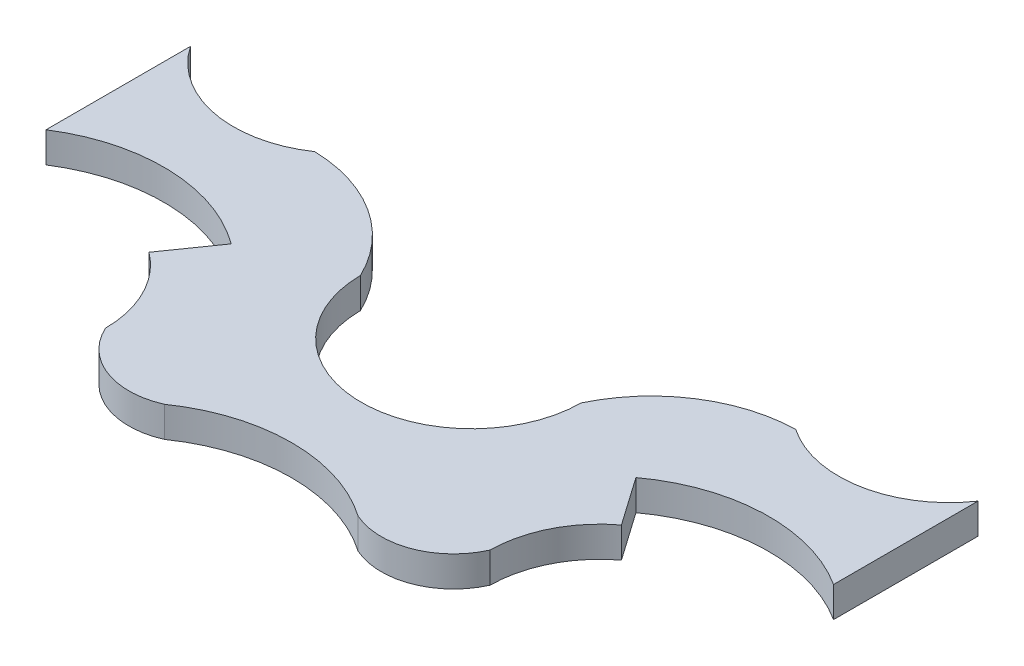
ISO-10303-21;
HEADER;
FILE_DESCRIPTION(('STEP AP214'),'2;1');
FILE_NAME('part.step','',(''),(''),'','','');
FILE_SCHEMA(('AUTOMOTIVE_DESIGN { 1 0 10303 214 1 1 1 1 }'));
ENDSEC;
DATA;
#1=APPLICATION_CONTEXT('core data for automotive mechanical design processes');
#2=APPLICATION_PROTOCOL_DEFINITION('international standard','automotive_design',2000,#1);
#3=PRODUCT_CONTEXT('',#1,'mechanical');
#4=PRODUCT('Part','Part','',(#3));
#5=PRODUCT_RELATED_PRODUCT_CATEGORY('part','',(#4));
#6=PRODUCT_DEFINITION_FORMATION('','',#4);
#7=PRODUCT_DEFINITION_CONTEXT('part definition',#1,'design');
#8=PRODUCT_DEFINITION('design','',#6,#7);
#9=PRODUCT_DEFINITION_SHAPE('','',#8);
#10=(LENGTH_UNIT() NAMED_UNIT(*) SI_UNIT(.MILLI.,.METRE.));
#11=(NAMED_UNIT(*) PLANE_ANGLE_UNIT() SI_UNIT($,.RADIAN.));
#12=(NAMED_UNIT(*) SI_UNIT($,.STERADIAN.) SOLID_ANGLE_UNIT());
#13=UNCERTAINTY_MEASURE_WITH_UNIT(LENGTH_MEASURE(1.E-05),#10,'distance_accuracy_value','');
#14=(GEOMETRIC_REPRESENTATION_CONTEXT(3) GLOBAL_UNCERTAINTY_ASSIGNED_CONTEXT((#13)) GLOBAL_UNIT_ASSIGNED_CONTEXT((#10,
#11,#12)) REPRESENTATION_CONTEXT('',''));
#15=CARTESIAN_POINT('',(0.,0.,0.));
#16=DIRECTION('',(0.,0.,1.));
#17=DIRECTION('',(1.,0.,0.));
#18=AXIS2_PLACEMENT_3D('',#15,#16,#17);
#19=CARTESIAN_POINT('',(-19.8752830168529,0.,-11.4749999999999));
#20=DIRECTION('',(0.,-1.,0.));
#21=DIRECTION('',(0.,0.,-1.));
#22=AXIS2_PLACEMENT_3D('',#19,#20,#21);
#23=PLANE('',#22);
#24=CARTESIAN_POINT('',(-16.0451571243017,0.,-18.6855970410039));
#25=DIRECTION('',(0.,-1.,0.));
#26=DIRECTION('',(0.,0.,-1.));
#27=AXIS2_PLACEMENT_3D('',#24,#25,#26);
#28=CIRCLE('',#27,9.75000000000001);
#29=CARTESIAN_POINT('',(-7.24977737852357,0.,-22.8931848449072));
#30=VERTEX_POINT('',#29);
#31=CARTESIAN_POINT('',(-15.7947184689362,0.,-28.4323801246628));
#32=VERTEX_POINT('',#31);
#33=EDGE_CURVE('E171',#30,#32,#28,.F.);
#34=ORIENTED_EDGE('',*,*,#33,.F.);
#35=CARTESIAN_POINT('',(0.,0.,-22.95));
#36=DIRECTION('',(0.,-1.,0.));
#37=DIRECTION('',(0.,0.,-1.));
#38=AXIS2_PLACEMENT_3D('',#35,#36,#37);
#39=CIRCLE('',#38,7.25);
#40=CARTESIAN_POINT('',(7.24977737852353,0.,-22.8931848449072));
#41=VERTEX_POINT('',#40);
#42=EDGE_CURVE('E63',#41,#30,#39,.T.);
#43=ORIENTED_EDGE('',*,*,#42,.F.);
#44=CARTESIAN_POINT('',(16.0451571243017,0.,-18.6855970410039));
#45=DIRECTION('',(0.,-1.,0.));
#46=DIRECTION('',(0.,0.,-1.));
#47=AXIS2_PLACEMENT_3D('',#44,#45,#46);
#48=CIRCLE('',#47,9.75);
#49=CARTESIAN_POINT('',(15.7947184689361,0.,-28.4323801246628));
#50=VERTEX_POINT('',#49);
#51=EDGE_CURVE('E161',#50,#41,#48,.F.);
#52=ORIENTED_EDGE('',*,*,#51,.F.);
#53=CARTESIAN_POINT('',(19.8752830168529,0.,-34.4249999999998));
#54=DIRECTION('',(0.,-1.,0.));
#55=DIRECTION('',(0.,0.,-1.));
#56=AXIS2_PLACEMENT_3D('',#53,#54,#55);
#57=CIRCLE('',#56,7.24999999999996);
#58=CARTESIAN_POINT('',(25.8629267621705,0.,-30.3371371868469));
#59=VERTEX_POINT('',#58);
#60=EDGE_CURVE('E11',#59,#50,#57,.T.);
#61=ORIENTED_EDGE('',*,*,#60,.F.);
#62=DIRECTION('',(0.,0.,-1.));
#63=VECTOR('',#62,1.);
#64=CARTESIAN_POINT('',(25.8629267621705,0.,-20.8512331124582));
#65=LINE('',#64,#63);
#66=CARTESIAN_POINT('',(25.8629267621705,0.,-20.8512331124582));
#67=VERTEX_POINT('',#66);
#68=EDGE_CURVE('E47',#67,#59,#65,.T.);
#69=ORIENTED_EDGE('',*,*,#68,.F.);
#70=CARTESIAN_POINT('',(19.8752830168529,0.,-11.4749999999999));
#71=DIRECTION('',(0.,-1.,0.));
#72=DIRECTION('',(0.,0.,-1.));
#73=AXIS2_PLACEMENT_3D('',#70,#71,#72);
#74=CIRCLE('',#73,11.125);
#75=CARTESIAN_POINT('',(13.2910685245966,0.,-20.4423711041731));
#76=VERTEX_POINT('',#75);
#77=EDGE_CURVE('E180',#76,#67,#74,.T.);
#78=ORIENTED_EDGE('',*,*,#77,.F.);
#79=DIRECTION('',(-0.573576436351048,0.,-0.81915204428899));
#80=VECTOR('',#79,1.);
#81=CARTESIAN_POINT('',(15.5145388898308,0.,-17.2669263340136));
#82=LINE('',#81,#80);
#83=CARTESIAN_POINT('',(15.5145388898308,0.,-17.2669263340136));
#84=VERTEX_POINT('',#83);
#85=EDGE_CURVE('E183',#84,#76,#82,.T.);
#86=ORIENTED_EDGE('',*,*,#85,.F.);
#87=CARTESIAN_POINT('',(19.8752830168529,0.,-11.4749999999999));
#88=DIRECTION('',(0.,-1.,0.));
#89=DIRECTION('',(0.,0.,-1.));
#90=AXIS2_PLACEMENT_3D('',#87,#88,#89);
#91=CIRCLE('',#90,7.25000000000001);
#92=CARTESIAN_POINT('',(12.6254775107962,0.,-11.5281048429938));
#93=VERTEX_POINT('',#92);
#94=EDGE_CURVE('E186',#93,#84,#91,.T.);
#95=ORIENTED_EDGE('',*,*,#94,.F.);
#96=CARTESIAN_POINT('',(8.28958586898089,0.,-13.4678325740005));
#97=DIRECTION('',(0.,-1.,0.));
#98=DIRECTION('',(0.,0.,-1.));
#99=AXIS2_PLACEMENT_3D('',#96,#97,#98);
#100=CIRCLE('',#99,4.75000000000001);
#101=CARTESIAN_POINT('',(6.36135911524319,0.,-9.12681407759096));
#102=VERTEX_POINT('',#101);
#103=EDGE_CURVE('E189',#102,#93,#100,.F.);
#104=ORIENTED_EDGE('',*,*,#103,.F.);
#105=CARTESIAN_POINT('',(0.,0.,0.));
#106=DIRECTION('',(0.,-1.,0.));
#107=DIRECTION('',(0.,0.,-1.));
#108=AXIS2_PLACEMENT_3D('',#105,#106,#107);
#109=CIRCLE('',#108,11.125);
#110=CARTESIAN_POINT('',(-6.36135911524322,0.,-9.12681407759092));
#111=VERTEX_POINT('',#110);
#112=EDGE_CURVE('E192',#111,#102,#109,.T.);
#113=ORIENTED_EDGE('',*,*,#112,.F.);
#114=CARTESIAN_POINT('',(-8.28958586898088,0.,-13.4678325740005));
#115=DIRECTION('',(0.,-1.,0.));
#116=DIRECTION('',(0.,0.,-1.));
#117=AXIS2_PLACEMENT_3D('',#114,#115,#116);
#118=CIRCLE('',#117,4.75000000000001);
#119=CARTESIAN_POINT('',(-12.6254775107962,0.,-11.5281048429938));
#120=VERTEX_POINT('',#119);
#121=EDGE_CURVE('E195',#120,#111,#118,.F.);
#122=ORIENTED_EDGE('',*,*,#121,.F.);
#123=CARTESIAN_POINT('',(-19.8752830168529,0.,-11.4749999999999));
#124=DIRECTION('',(0.,-1.,0.));
#125=DIRECTION('',(0.,0.,-1.));
#126=AXIS2_PLACEMENT_3D('',#123,#124,#125);
#127=CIRCLE('',#126,7.25000000000003);
#128=CARTESIAN_POINT('',(-15.5145388898308,0.,-17.2669263340136));
#129=VERTEX_POINT('',#128);
#130=EDGE_CURVE('E198',#129,#120,#127,.T.);
#131=ORIENTED_EDGE('',*,*,#130,.F.);
#132=DIRECTION('',(-0.573576436351043,0.,0.819152044288994));
#133=VECTOR('',#132,1.);
#134=CARTESIAN_POINT('',(-13.2910685245966,0.,-20.4423711041731));
#135=LINE('',#134,#133);
#136=CARTESIAN_POINT('',(-13.2910685245966,0.,-20.4423711041731));
#137=VERTEX_POINT('',#136);
#138=EDGE_CURVE('E201',#137,#129,#135,.T.);
#139=ORIENTED_EDGE('',*,*,#138,.F.);
#140=CARTESIAN_POINT('',(-19.8752830168529,0.,-11.4749999999999));
#141=DIRECTION('',(0.,-1.,0.));
#142=DIRECTION('',(0.,0.,-1.));
#143=AXIS2_PLACEMENT_3D('',#140,#141,#142);
#144=CIRCLE('',#143,11.125);
#145=CARTESIAN_POINT('',(-25.8629267621706,0.,-20.8512331124582));
#146=VERTEX_POINT('',#145);
#147=EDGE_CURVE('E204',#146,#137,#144,.T.);
#148=ORIENTED_EDGE('',*,*,#147,.F.);
#149=DIRECTION('',(0.,0.,1.));
#150=VECTOR('',#149,1.);
#151=CARTESIAN_POINT('',(-25.8629267621706,0.,-30.3371371868468));
#152=LINE('',#151,#150);
#153=CARTESIAN_POINT('',(-25.8629267621706,0.,-30.3371371868468));
#154=VERTEX_POINT('',#153);
#155=EDGE_CURVE('E207',#154,#146,#152,.T.);
#156=ORIENTED_EDGE('',*,*,#155,.F.);
#157=CARTESIAN_POINT('',(-19.875283016853,0.,-34.4249999999999));
#158=DIRECTION('',(0.,-1.,0.));
#159=DIRECTION('',(0.,0.,-1.));
#160=AXIS2_PLACEMENT_3D('',#157,#158,#159);
#161=CIRCLE('',#160,7.25000000000002);
#162=EDGE_CURVE('E173',#32,#154,#161,.T.);
#163=ORIENTED_EDGE('',*,*,#162,.F.);
#164=EDGE_LOOP('',(#34,#43,#52,#61,#69,#78,#86,#95,#104,#113,#122,#131,#139,#148,#156,#163));
#165=FACE_BOUND('',#164,.T.);
#166=ADVANCED_FACE('F39',(#165),#23,.T.);
#167=CARTESIAN_POINT('',(0.,-74.0627965181437,-22.95));
#168=DIRECTION('',(0.,1.,0.));
#169=DIRECTION('',(0.,0.,1.));
#170=AXIS2_PLACEMENT_3D('',#167,#168,#169);
#171=CYLINDRICAL_SURFACE('',#170,7.25);
#172=ORIENTED_EDGE('',*,*,#42,.T.);
#173=DIRECTION('',(0.,1.,0.));
#174=VECTOR('',#173,1.);
#175=CARTESIAN_POINT('',(-7.24977737852357,-74.0627965181437,-22.8931848449072));
#176=LINE('',#175,#174);
#177=CARTESIAN_POINT('',(-7.24977737852357,2.,-22.8931848449072));
#178=VERTEX_POINT('',#177);
#179=EDGE_CURVE('E42',#30,#178,#176,.T.);
#180=ORIENTED_EDGE('',*,*,#179,.T.);
#181=CARTESIAN_POINT('',(0.,2.,-22.95));
#182=DIRECTION('',(0.,-1.,0.));
#183=DIRECTION('',(0.,0.,1.));
#184=AXIS2_PLACEMENT_3D('',#181,#182,#183);
#185=CIRCLE('',#184,7.25);
#186=CARTESIAN_POINT('',(7.24977737852353,2.,-22.8931848449072));
#187=VERTEX_POINT('',#186);
#188=EDGE_CURVE('E155',#187,#178,#185,.T.);
#189=ORIENTED_EDGE('',*,*,#188,.F.);
#190=DIRECTION('',(0.,1.,0.));
#191=VECTOR('',#190,1.);
#192=CARTESIAN_POINT('',(7.24977737852353,-74.0627965181437,-22.8931848449072));
#193=LINE('',#192,#191);
#194=EDGE_CURVE('E151',#41,#187,#193,.T.);
#195=ORIENTED_EDGE('',*,*,#194,.F.);
#196=EDGE_LOOP('',(#172,#180,#189,#195));
#197=FACE_BOUND('',#196,.T.);
#198=ADVANCED_FACE('F153',(#197),#171,.F.);
#199=CARTESIAN_POINT('',(16.0451571243017,-74.0627965181437,-18.6855970410039));
#200=DIRECTION('',(0.,1.,0.));
#201=DIRECTION('',(0.,0.,1.));
#202=AXIS2_PLACEMENT_3D('',#199,#200,#201);
#203=CYLINDRICAL_SURFACE('',#202,9.75);
#204=ORIENTED_EDGE('',*,*,#51,.T.);
#205=ORIENTED_EDGE('',*,*,#194,.T.);
#206=CARTESIAN_POINT('',(16.0451571243017,2.,-18.6855970410039));
#207=DIRECTION('',(0.,1.,0.));
#208=DIRECTION('',(0.,0.,1.));
#209=AXIS2_PLACEMENT_3D('',#206,#207,#208);
#210=CIRCLE('',#209,9.75);
#211=CARTESIAN_POINT('',(15.7947184689361,2.,-28.4323801246628));
#212=VERTEX_POINT('',#211);
#213=EDGE_CURVE('E213',#212,#187,#210,.T.);
#214=ORIENTED_EDGE('',*,*,#213,.F.);
#215=DIRECTION('',(0.,1.,0.));
#216=VECTOR('',#215,1.);
#217=CARTESIAN_POINT('',(15.7947184689361,-74.0627965181437,-28.4323801246628));
#218=LINE('',#217,#216);
#219=EDGE_CURVE('E163',#50,#212,#218,.T.);
#220=ORIENTED_EDGE('',*,*,#219,.F.);
#221=EDGE_LOOP('',(#204,#205,#214,#220));
#222=FACE_BOUND('',#221,.T.);
#223=ADVANCED_FACE('F162',(#222),#203,.T.);
#224=CARTESIAN_POINT('',(19.8752830168529,-74.0627965181437,-34.4249999999998));
#225=DIRECTION('',(0.,1.,0.));
#226=DIRECTION('',(0.,0.,1.));
#227=AXIS2_PLACEMENT_3D('',#224,#225,#226);
#228=CYLINDRICAL_SURFACE('',#227,7.24999999999996);
#229=ORIENTED_EDGE('',*,*,#60,.T.);
#230=ORIENTED_EDGE('',*,*,#219,.T.);
#231=CARTESIAN_POINT('',(19.8752830168529,2.,-34.4249999999998));
#232=DIRECTION('',(0.,-1.,0.));
#233=DIRECTION('',(0.,0.,1.));
#234=AXIS2_PLACEMENT_3D('',#231,#232,#233);
#235=CIRCLE('',#234,7.24999999999996);
#236=CARTESIAN_POINT('',(25.8629267621705,2.,-30.3371371868469));
#237=VERTEX_POINT('',#236);
#238=EDGE_CURVE('E216',#237,#212,#235,.T.);
#239=ORIENTED_EDGE('',*,*,#238,.F.);
#240=DIRECTION('',(0.,1.,0.));
#241=VECTOR('',#240,1.);
#242=CARTESIAN_POINT('',(25.8629267621705,-74.0627965181437,-30.3371371868469));
#243=LINE('',#242,#241);
#244=EDGE_CURVE('E214',#59,#237,#243,.T.);
#245=ORIENTED_EDGE('',*,*,#244,.F.);
#246=EDGE_LOOP('',(#229,#230,#239,#245));
#247=FACE_BOUND('',#246,.T.);
#248=ADVANCED_FACE('F322',(#247),#228,.F.);
#249=CARTESIAN_POINT('',(25.8629267621705,-74.0627965181437,-20.8512331124582));
#250=DIRECTION('',(1.,0.,0.));
#251=DIRECTION('',(0.,0.,-1.));
#252=AXIS2_PLACEMENT_3D('',#249,#250,#251);
#253=PLANE('',#252);
#254=ORIENTED_EDGE('',*,*,#68,.T.);
#255=ORIENTED_EDGE('',*,*,#244,.T.);
#256=DIRECTION('',(0.,0.,-1.));
#257=VECTOR('',#256,1.);
#258=CARTESIAN_POINT('',(25.8629267621705,2.,-20.8512331124582));
#259=LINE('',#258,#257);
#260=CARTESIAN_POINT('',(25.8629267621705,2.,-20.8512331124582));
#261=VERTEX_POINT('',#260);
#262=EDGE_CURVE('E219',#261,#237,#259,.T.);
#263=ORIENTED_EDGE('',*,*,#262,.F.);
#264=DIRECTION('',(0.,1.,0.));
#265=VECTOR('',#264,1.);
#266=CARTESIAN_POINT('',(25.8629267621705,-74.0627965181437,-20.8512331124582));
#267=LINE('',#266,#265);
#268=EDGE_CURVE('E217',#67,#261,#267,.T.);
#269=ORIENTED_EDGE('',*,*,#268,.F.);
#270=EDGE_LOOP('',(#254,#255,#263,#269));
#271=FACE_BOUND('',#270,.T.);
#272=ADVANCED_FACE('F320',(#271),#253,.T.);
#273=CARTESIAN_POINT('',(19.8752830168529,-74.0627965181437,-11.4749999999999));
#274=DIRECTION('',(0.,1.,0.));
#275=DIRECTION('',(0.,0.,1.));
#276=AXIS2_PLACEMENT_3D('',#273,#274,#275);
#277=CYLINDRICAL_SURFACE('',#276,11.125);
#278=ORIENTED_EDGE('',*,*,#77,.T.);
#279=ORIENTED_EDGE('',*,*,#268,.T.);
#280=CARTESIAN_POINT('',(19.8752830168529,2.,-11.4749999999999));
#281=DIRECTION('',(0.,-1.,0.));
#282=DIRECTION('',(0.,0.,1.));
#283=AXIS2_PLACEMENT_3D('',#280,#281,#282);
#284=CIRCLE('',#283,11.125);
#285=CARTESIAN_POINT('',(13.2910685245966,2.,-20.4423711041731));
#286=VERTEX_POINT('',#285);
#287=EDGE_CURVE('E222',#286,#261,#284,.T.);
#288=ORIENTED_EDGE('',*,*,#287,.F.);
#289=DIRECTION('',(0.,1.,0.));
#290=VECTOR('',#289,1.);
#291=CARTESIAN_POINT('',(13.2910685245966,-74.0627965181437,-20.4423711041731));
#292=LINE('',#291,#290);
#293=EDGE_CURVE('E220',#76,#286,#292,.T.);
#294=ORIENTED_EDGE('',*,*,#293,.F.);
#295=EDGE_LOOP('',(#278,#279,#288,#294));
#296=FACE_BOUND('',#295,.T.);
#297=ADVANCED_FACE('F316',(#296),#277,.F.);
#298=CARTESIAN_POINT('',(15.5145388898308,-74.0627965181437,-17.2669263340136));
#299=DIRECTION('',(0.81915204428899,0.,-0.573576436351048));
#300=DIRECTION('',(-0.573576436351048,0.,-0.81915204428899));
#301=AXIS2_PLACEMENT_3D('',#298,#299,#300);
#302=PLANE('',#301);
#303=ORIENTED_EDGE('',*,*,#85,.T.);
#304=ORIENTED_EDGE('',*,*,#293,.T.);
#305=DIRECTION('',(-0.573576436351048,0.,-0.81915204428899));
#306=VECTOR('',#305,1.);
#307=CARTESIAN_POINT('',(15.5145388898308,2.,-17.2669263340136));
#308=LINE('',#307,#306);
#309=CARTESIAN_POINT('',(15.5145388898308,2.,-17.2669263340136));
#310=VERTEX_POINT('',#309);
#311=EDGE_CURVE('E225',#310,#286,#308,.T.);
#312=ORIENTED_EDGE('',*,*,#311,.F.);
#313=DIRECTION('',(0.,1.,0.));
#314=VECTOR('',#313,1.);
#315=CARTESIAN_POINT('',(15.5145388898308,-74.0627965181437,-17.2669263340136));
#316=LINE('',#315,#314);
#317=EDGE_CURVE('E223',#84,#310,#316,.T.);
#318=ORIENTED_EDGE('',*,*,#317,.F.);
#319=EDGE_LOOP('',(#303,#304,#312,#318));
#320=FACE_BOUND('',#319,.T.);
#321=ADVANCED_FACE('F312',(#320),#302,.T.);
#322=CARTESIAN_POINT('',(19.8752830168529,-74.0627965181437,-11.4749999999999));
#323=DIRECTION('',(0.,1.,0.));
#324=DIRECTION('',(0.,0.,1.));
#325=AXIS2_PLACEMENT_3D('',#322,#323,#324);
#326=CYLINDRICAL_SURFACE('',#325,7.25000000000001);
#327=ORIENTED_EDGE('',*,*,#94,.T.);
#328=ORIENTED_EDGE('',*,*,#317,.T.);
#329=CARTESIAN_POINT('',(19.8752830168529,2.,-11.4749999999999));
#330=DIRECTION('',(0.,-1.,0.));
#331=DIRECTION('',(0.,0.,1.));
#332=AXIS2_PLACEMENT_3D('',#329,#330,#331);
#333=CIRCLE('',#332,7.25000000000001);
#334=CARTESIAN_POINT('',(12.6254775107962,2.,-11.5281048429938));
#335=VERTEX_POINT('',#334);
#336=EDGE_CURVE('E228',#335,#310,#333,.T.);
#337=ORIENTED_EDGE('',*,*,#336,.F.);
#338=DIRECTION('',(0.,1.,0.));
#339=VECTOR('',#338,1.);
#340=CARTESIAN_POINT('',(12.6254775107962,-74.0627965181437,-11.5281048429938));
#341=LINE('',#340,#339);
#342=EDGE_CURVE('E226',#93,#335,#341,.T.);
#343=ORIENTED_EDGE('',*,*,#342,.F.);
#344=EDGE_LOOP('',(#327,#328,#337,#343));
#345=FACE_BOUND('',#344,.T.);
#346=ADVANCED_FACE('F308',(#345),#326,.F.);
#347=CARTESIAN_POINT('',(8.28958586898089,-74.0627965181437,-13.4678325740005));
#348=DIRECTION('',(0.,1.,0.));
#349=DIRECTION('',(0.,0.,1.));
#350=AXIS2_PLACEMENT_3D('',#347,#348,#349);
#351=CYLINDRICAL_SURFACE('',#350,4.75000000000001);
#352=ORIENTED_EDGE('',*,*,#103,.T.);
#353=ORIENTED_EDGE('',*,*,#342,.T.);
#354=CARTESIAN_POINT('',(8.28958586898089,2.,-13.4678325740005));
#355=DIRECTION('',(0.,1.,0.));
#356=DIRECTION('',(0.,0.,1.));
#357=AXIS2_PLACEMENT_3D('',#354,#355,#356);
#358=CIRCLE('',#357,4.75000000000001);
#359=CARTESIAN_POINT('',(6.36135911524319,2.,-9.12681407759096));
#360=VERTEX_POINT('',#359);
#361=EDGE_CURVE('E231',#360,#335,#358,.T.);
#362=ORIENTED_EDGE('',*,*,#361,.F.);
#363=DIRECTION('',(0.,1.,0.));
#364=VECTOR('',#363,1.);
#365=CARTESIAN_POINT('',(6.36135911524319,-74.0627965181437,-9.12681407759096));
#366=LINE('',#365,#364);
#367=EDGE_CURVE('E229',#102,#360,#366,.T.);
#368=ORIENTED_EDGE('',*,*,#367,.F.);
#369=EDGE_LOOP('',(#352,#353,#362,#368));
#370=FACE_BOUND('',#369,.T.);
#371=ADVANCED_FACE('F304',(#370),#351,.T.);
#372=CARTESIAN_POINT('',(0.,-74.0627965181437,0.));
#373=DIRECTION('',(0.,1.,0.));
#374=DIRECTION('',(0.,0.,1.));
#375=AXIS2_PLACEMENT_3D('',#372,#373,#374);
#376=CYLINDRICAL_SURFACE('',#375,11.125);
#377=ORIENTED_EDGE('',*,*,#112,.T.);
#378=ORIENTED_EDGE('',*,*,#367,.T.);
#379=CARTESIAN_POINT('',(0.,2.,0.));
#380=DIRECTION('',(0.,-1.,0.));
#381=DIRECTION('',(0.,0.,1.));
#382=AXIS2_PLACEMENT_3D('',#379,#380,#381);
#383=CIRCLE('',#382,11.125);
#384=CARTESIAN_POINT('',(-6.36135911524322,2.,-9.12681407759092));
#385=VERTEX_POINT('',#384);
#386=EDGE_CURVE('E234',#385,#360,#383,.T.);
#387=ORIENTED_EDGE('',*,*,#386,.F.);
#388=DIRECTION('',(0.,1.,0.));
#389=VECTOR('',#388,1.);
#390=CARTESIAN_POINT('',(-6.36135911524322,-74.0627965181437,-9.12681407759092));
#391=LINE('',#390,#389);
#392=EDGE_CURVE('E232',#111,#385,#391,.T.);
#393=ORIENTED_EDGE('',*,*,#392,.F.);
#394=EDGE_LOOP('',(#377,#378,#387,#393));
#395=FACE_BOUND('',#394,.T.);
#396=ADVANCED_FACE('F300',(#395),#376,.F.);
#397=CARTESIAN_POINT('',(-8.28958586898088,-74.0627965181437,-13.4678325740005));
#398=DIRECTION('',(0.,1.,0.));
#399=DIRECTION('',(0.,0.,1.));
#400=AXIS2_PLACEMENT_3D('',#397,#398,#399);
#401=CYLINDRICAL_SURFACE('',#400,4.75000000000001);
#402=ORIENTED_EDGE('',*,*,#121,.T.);
#403=ORIENTED_EDGE('',*,*,#392,.T.);
#404=CARTESIAN_POINT('',(-8.28958586898088,2.,-13.4678325740005));
#405=DIRECTION('',(0.,1.,0.));
#406=DIRECTION('',(0.,0.,1.));
#407=AXIS2_PLACEMENT_3D('',#404,#405,#406);
#408=CIRCLE('',#407,4.75000000000001);
#409=CARTESIAN_POINT('',(-12.6254775107962,2.,-11.5281048429938));
#410=VERTEX_POINT('',#409);
#411=EDGE_CURVE('E237',#410,#385,#408,.T.);
#412=ORIENTED_EDGE('',*,*,#411,.F.);
#413=DIRECTION('',(0.,1.,0.));
#414=VECTOR('',#413,1.);
#415=CARTESIAN_POINT('',(-12.6254775107962,-74.0627965181437,-11.5281048429938));
#416=LINE('',#415,#414);
#417=EDGE_CURVE('E235',#120,#410,#416,.T.);
#418=ORIENTED_EDGE('',*,*,#417,.F.);
#419=EDGE_LOOP('',(#402,#403,#412,#418));
#420=FACE_BOUND('',#419,.T.);
#421=ADVANCED_FACE('F296',(#420),#401,.T.);
#422=CARTESIAN_POINT('',(-19.8752830168529,-74.0627965181437,-11.4749999999999));
#423=DIRECTION('',(0.,1.,0.));
#424=DIRECTION('',(0.,0.,1.));
#425=AXIS2_PLACEMENT_3D('',#422,#423,#424);
#426=CYLINDRICAL_SURFACE('',#425,7.25000000000003);
#427=ORIENTED_EDGE('',*,*,#130,.T.);
#428=ORIENTED_EDGE('',*,*,#417,.T.);
#429=CARTESIAN_POINT('',(-19.8752830168529,2.,-11.4749999999999));
#430=DIRECTION('',(0.,-1.,0.));
#431=DIRECTION('',(0.,0.,1.));
#432=AXIS2_PLACEMENT_3D('',#429,#430,#431);
#433=CIRCLE('',#432,7.25000000000003);
#434=CARTESIAN_POINT('',(-15.5145388898308,2.,-17.2669263340136));
#435=VERTEX_POINT('',#434);
#436=EDGE_CURVE('E240',#435,#410,#433,.T.);
#437=ORIENTED_EDGE('',*,*,#436,.F.);
#438=DIRECTION('',(0.,1.,0.));
#439=VECTOR('',#438,1.);
#440=CARTESIAN_POINT('',(-15.5145388898308,-74.0627965181437,-17.2669263340136));
#441=LINE('',#440,#439);
#442=EDGE_CURVE('E238',#129,#435,#441,.T.);
#443=ORIENTED_EDGE('',*,*,#442,.F.);
#444=EDGE_LOOP('',(#427,#428,#437,#443));
#445=FACE_BOUND('',#444,.T.);
#446=ADVANCED_FACE('F292',(#445),#426,.F.);
#447=CARTESIAN_POINT('',(-13.2910685245966,-74.0627965181437,-20.4423711041731));
#448=DIRECTION('',(-0.819152044288994,0.,-0.573576436351043));
#449=DIRECTION('',(-0.573576436351043,0.,0.819152044288994));
#450=AXIS2_PLACEMENT_3D('',#447,#448,#449);
#451=PLANE('',#450);
#452=ORIENTED_EDGE('',*,*,#138,.T.);
#453=ORIENTED_EDGE('',*,*,#442,.T.);
#454=DIRECTION('',(-0.573576436351043,0.,0.819152044288994));
#455=VECTOR('',#454,1.);
#456=CARTESIAN_POINT('',(-13.2910685245966,2.,-20.4423711041731));
#457=LINE('',#456,#455);
#458=CARTESIAN_POINT('',(-13.2910685245966,2.,-20.4423711041731));
#459=VERTEX_POINT('',#458);
#460=EDGE_CURVE('E243',#459,#435,#457,.T.);
#461=ORIENTED_EDGE('',*,*,#460,.F.);
#462=DIRECTION('',(0.,1.,0.));
#463=VECTOR('',#462,1.);
#464=CARTESIAN_POINT('',(-13.2910685245966,-74.0627965181437,-20.4423711041731));
#465=LINE('',#464,#463);
#466=EDGE_CURVE('E241',#137,#459,#465,.T.);
#467=ORIENTED_EDGE('',*,*,#466,.F.);
#468=EDGE_LOOP('',(#452,#453,#461,#467));
#469=FACE_BOUND('',#468,.T.);
#470=ADVANCED_FACE('F288',(#469),#451,.T.);
#471=CARTESIAN_POINT('',(-19.8752830168529,-74.0627965181437,-11.4749999999999));
#472=DIRECTION('',(0.,1.,0.));
#473=DIRECTION('',(0.,0.,1.));
#474=AXIS2_PLACEMENT_3D('',#471,#472,#473);
#475=CYLINDRICAL_SURFACE('',#474,11.125);
#476=ORIENTED_EDGE('',*,*,#147,.T.);
#477=ORIENTED_EDGE('',*,*,#466,.T.);
#478=CARTESIAN_POINT('',(-19.8752830168529,2.,-11.4749999999999));
#479=DIRECTION('',(0.,-1.,0.));
#480=DIRECTION('',(0.,0.,1.));
#481=AXIS2_PLACEMENT_3D('',#478,#479,#480);
#482=CIRCLE('',#481,11.125);
#483=CARTESIAN_POINT('',(-25.8629267621706,2.,-20.8512331124582));
#484=VERTEX_POINT('',#483);
#485=EDGE_CURVE('E246',#484,#459,#482,.T.);
#486=ORIENTED_EDGE('',*,*,#485,.F.);
#487=DIRECTION('',(0.,1.,0.));
#488=VECTOR('',#487,1.);
#489=CARTESIAN_POINT('',(-25.8629267621706,-74.0627965181437,-20.8512331124582));
#490=LINE('',#489,#488);
#491=EDGE_CURVE('E244',#146,#484,#490,.T.);
#492=ORIENTED_EDGE('',*,*,#491,.F.);
#493=EDGE_LOOP('',(#476,#477,#486,#492));
#494=FACE_BOUND('',#493,.T.);
#495=ADVANCED_FACE('F326',(#494),#475,.F.);
#496=CARTESIAN_POINT('',(-25.8629267621706,-74.0627965181437,-30.3371371868468));
#497=DIRECTION('',(-1.,0.,0.));
#498=DIRECTION('',(0.,0.,1.));
#499=AXIS2_PLACEMENT_3D('',#496,#497,#498);
#500=PLANE('',#499);
#501=ORIENTED_EDGE('',*,*,#155,.T.);
#502=ORIENTED_EDGE('',*,*,#491,.T.);
#503=DIRECTION('',(0.,0.,1.));
#504=VECTOR('',#503,1.);
#505=CARTESIAN_POINT('',(-25.8629267621706,2.,-30.3371371868468));
#506=LINE('',#505,#504);
#507=CARTESIAN_POINT('',(-25.8629267621706,2.,-30.3371371868468));
#508=VERTEX_POINT('',#507);
#509=EDGE_CURVE('E248',#508,#484,#506,.T.);
#510=ORIENTED_EDGE('',*,*,#509,.F.);
#511=DIRECTION('',(0.,1.,0.));
#512=VECTOR('',#511,1.);
#513=CARTESIAN_POINT('',(-25.8629267621706,-74.0627965181437,-30.3371371868468));
#514=LINE('',#513,#512);
#515=EDGE_CURVE('E247',#154,#508,#514,.T.);
#516=ORIENTED_EDGE('',*,*,#515,.F.);
#517=EDGE_LOOP('',(#501,#502,#510,#516));
#518=FACE_BOUND('',#517,.T.);
#519=ADVANCED_FACE('F328',(#518),#500,.T.);
#520=CARTESIAN_POINT('',(-19.875283016853,-74.0627965181437,-34.4249999999999));
#521=DIRECTION('',(0.,1.,0.));
#522=DIRECTION('',(0.,0.,1.));
#523=AXIS2_PLACEMENT_3D('',#520,#521,#522);
#524=CYLINDRICAL_SURFACE('',#523,7.25000000000002);
#525=ORIENTED_EDGE('',*,*,#162,.T.);
#526=ORIENTED_EDGE('',*,*,#515,.T.);
#527=CARTESIAN_POINT('',(-19.875283016853,2.,-34.4249999999999));
#528=DIRECTION('',(0.,-1.,0.));
#529=DIRECTION('',(0.,0.,1.));
#530=AXIS2_PLACEMENT_3D('',#527,#528,#529);
#531=CIRCLE('',#530,7.25000000000002);
#532=CARTESIAN_POINT('',(-15.7947184689362,2.,-28.4323801246628));
#533=VERTEX_POINT('',#532);
#534=EDGE_CURVE('E55',#533,#508,#531,.T.);
#535=ORIENTED_EDGE('',*,*,#534,.F.);
#536=DIRECTION('',(0.,1.,0.));
#537=VECTOR('',#536,1.);
#538=CARTESIAN_POINT('',(-15.7947184689362,-74.0627965181437,-28.4323801246628));
#539=LINE('',#538,#537);
#540=EDGE_CURVE('E249',#32,#533,#539,.T.);
#541=ORIENTED_EDGE('',*,*,#540,.F.);
#542=EDGE_LOOP('',(#525,#526,#535,#541));
#543=FACE_BOUND('',#542,.T.);
#544=ADVANCED_FACE('F329',(#543),#524,.F.);
#545=CARTESIAN_POINT('',(-16.0451571243017,-74.0627965181437,-18.6855970410039));
#546=DIRECTION('',(0.,1.,0.));
#547=DIRECTION('',(0.,0.,1.));
#548=AXIS2_PLACEMENT_3D('',#545,#546,#547);
#549=CYLINDRICAL_SURFACE('',#548,9.75000000000001);
#550=ORIENTED_EDGE('',*,*,#33,.T.);
#551=ORIENTED_EDGE('',*,*,#540,.T.);
#552=CARTESIAN_POINT('',(-16.0451571243017,2.,-18.6855970410039));
#553=DIRECTION('',(0.,1.,0.));
#554=DIRECTION('',(0.,0.,1.));
#555=AXIS2_PLACEMENT_3D('',#552,#553,#554);
#556=CIRCLE('',#555,9.75000000000001);
#557=EDGE_CURVE('E166',#178,#533,#556,.T.);
#558=ORIENTED_EDGE('',*,*,#557,.F.);
#559=ORIENTED_EDGE('',*,*,#179,.F.);
#560=EDGE_LOOP('',(#550,#551,#558,#559));
#561=FACE_BOUND('',#560,.T.);
#562=ADVANCED_FACE('F261',(#561),#549,.T.);
#563=CARTESIAN_POINT('',(-19.8752830168529,2.,-11.4749999999999));
#564=DIRECTION('',(0.,-1.,0.));
#565=DIRECTION('',(0.,0.,-1.));
#566=AXIS2_PLACEMENT_3D('',#563,#564,#565);
#567=PLANE('',#566);
#568=ORIENTED_EDGE('',*,*,#188,.T.);
#569=ORIENTED_EDGE('',*,*,#557,.T.);
#570=ORIENTED_EDGE('',*,*,#534,.T.);
#571=ORIENTED_EDGE('',*,*,#509,.T.);
#572=ORIENTED_EDGE('',*,*,#485,.T.);
#573=ORIENTED_EDGE('',*,*,#460,.T.);
#574=ORIENTED_EDGE('',*,*,#436,.T.);
#575=ORIENTED_EDGE('',*,*,#411,.T.);
#576=ORIENTED_EDGE('',*,*,#386,.T.);
#577=ORIENTED_EDGE('',*,*,#361,.T.);
#578=ORIENTED_EDGE('',*,*,#336,.T.);
#579=ORIENTED_EDGE('',*,*,#311,.T.);
#580=ORIENTED_EDGE('',*,*,#287,.T.);
#581=ORIENTED_EDGE('',*,*,#262,.T.);
#582=ORIENTED_EDGE('',*,*,#238,.T.);
#583=ORIENTED_EDGE('',*,*,#213,.T.);
#584=EDGE_LOOP('',(#568,#569,#570,#571,#572,#573,#574,#575,#576,#577,#578,#579,#580,#581,#582,#583));
#585=FACE_BOUND('',#584,.T.);
#586=ADVANCED_FACE('F262',(#585),#567,.F.);
#587=CLOSED_SHELL('',(#166,#198,#223,#248,#272,#297,#321,#346,#371,#396,#421,#446,#470,#495,
#519,#544,#562,#586));
#588=MANIFOLD_SOLID_BREP('B2',#587);
#589=ADVANCED_BREP_SHAPE_REPRESENTATION('',(#18,#588),#14);
#590=SHAPE_DEFINITION_REPRESENTATION(#9,#589);
ENDSEC;
END-ISO-10303-21;
